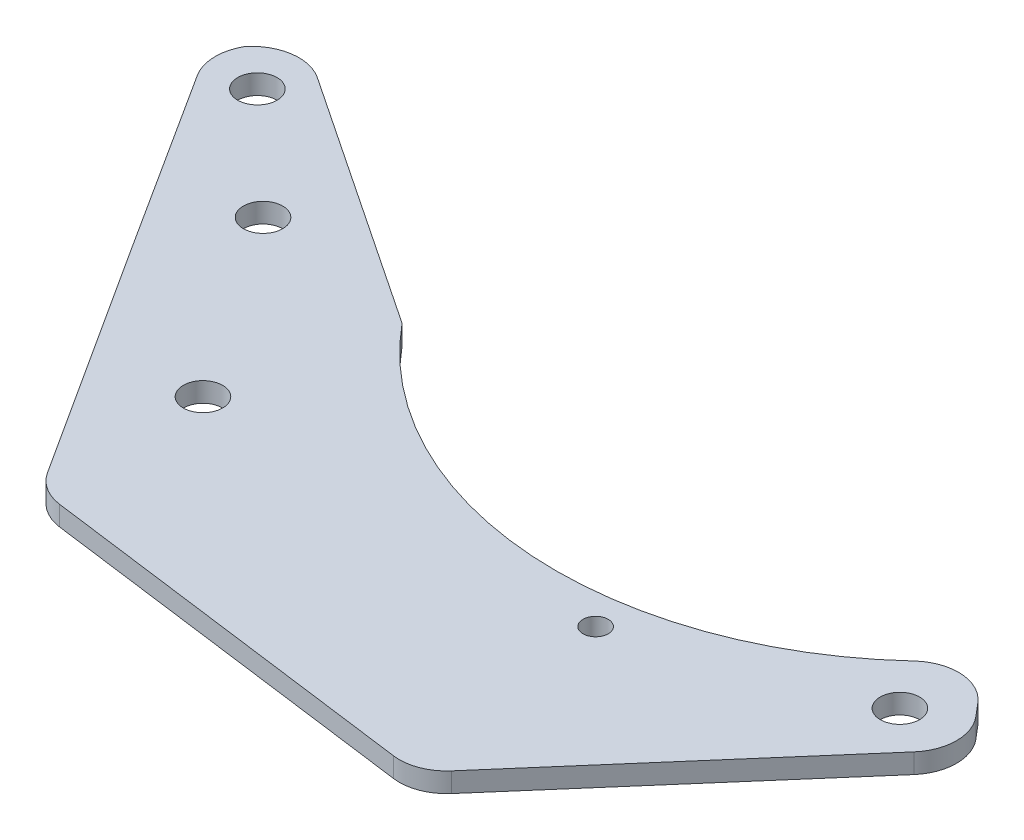
ISO-10303-21;
HEADER;
FILE_DESCRIPTION(('STEP AP214'),'2;1');
FILE_NAME('part.step','',(''),(''),'','','');
FILE_SCHEMA(('AUTOMOTIVE_DESIGN { 1 0 10303 214 1 1 1 1 }'));
ENDSEC;
DATA;
#1=APPLICATION_CONTEXT('core data for automotive mechanical design processes');
#2=APPLICATION_PROTOCOL_DEFINITION('international standard','automotive_design',2000,#1);
#3=PRODUCT_CONTEXT('',#1,'mechanical');
#4=PRODUCT('Part','Part','',(#3));
#5=PRODUCT_RELATED_PRODUCT_CATEGORY('part','',(#4));
#6=PRODUCT_DEFINITION_FORMATION('','',#4);
#7=PRODUCT_DEFINITION_CONTEXT('part definition',#1,'design');
#8=PRODUCT_DEFINITION('design','',#6,#7);
#9=PRODUCT_DEFINITION_SHAPE('','',#8);
#10=(LENGTH_UNIT() NAMED_UNIT(*) SI_UNIT(.MILLI.,.METRE.));
#11=(NAMED_UNIT(*) PLANE_ANGLE_UNIT() SI_UNIT($,.RADIAN.));
#12=(NAMED_UNIT(*) SI_UNIT($,.STERADIAN.) SOLID_ANGLE_UNIT());
#13=UNCERTAINTY_MEASURE_WITH_UNIT(LENGTH_MEASURE(1.E-05),#10,'distance_accuracy_value','');
#14=(GEOMETRIC_REPRESENTATION_CONTEXT(3) GLOBAL_UNCERTAINTY_ASSIGNED_CONTEXT((#13)) GLOBAL_UNIT_ASSIGNED_CONTEXT((#10,
#11,#12)) REPRESENTATION_CONTEXT('',''));
#15=CARTESIAN_POINT('',(0.,0.,0.));
#16=DIRECTION('',(0.,0.,1.));
#17=DIRECTION('',(1.,0.,0.));
#18=AXIS2_PLACEMENT_3D('',#15,#16,#17);
#19=CARTESIAN_POINT('',(47.1273199646575,3.175,-24.0867955846987));
#20=DIRECTION('',(0.,1.,0.));
#21=DIRECTION('',(0.,0.,1.));
#22=AXIS2_PLACEMENT_3D('',#19,#20,#21);
#23=PLANE('',#22);
#24=CARTESIAN_POINT('',(58.0978853827932,3.175,41.4677419040865));
#25=DIRECTION('',(0.,1.,0.));
#26=DIRECTION('',(0.,0.,1.));
#27=AXIS2_PLACEMENT_3D('',#24,#25,#26);
#28=CIRCLE('',#27,2.03200000000004);
#29=CARTESIAN_POINT('',(58.0978853827932,3.175,43.4997419040865));
#30=VERTEX_POINT('',#29);
#31=EDGE_CURVE('E615',#30,#30,#28,.T.);
#32=ORIENTED_EDGE('',*,*,#31,.F.);
#33=EDGE_LOOP('',(#32));
#34=FACE_BOUND('',#33,.T.);
#35=DIRECTION('',(-0.539216151652873,0.,-0.842167407227723));
#36=VECTOR('',#35,1.);
#37=CARTESIAN_POINT('',(-31.7827895527022,3.175,26.688950722057));
#38=LINE('',#37,#36);
#39=CARTESIAN_POINT('',(-31.7884003682894,3.175,26.6801875461005));
#40=VERTEX_POINT('',#39);
#41=CARTESIAN_POINT('',(-51.0580496985271,3.175,-3.41585198255375));
#42=VERTEX_POINT('',#41);
#43=EDGE_CURVE('E283',#40,#42,#38,.T.);
#44=ORIENTED_EDGE('',*,*,#43,.F.);
#45=CARTESIAN_POINT('',(-25.3710847252141,3.175,22.5713604705057));
#46=DIRECTION('',(0.,1.,0.));
#47=DIRECTION('',(0.,0.,1.));
#48=AXIS2_PLACEMENT_3D('',#45,#46,#47);
#49=CIRCLE('',#48,7.62);
#50=CARTESIAN_POINT('',(-31.777154824944,3.175,26.6976985416465));
#51=VERTEX_POINT('',#50);
#52=EDGE_CURVE('E370',#40,#51,#49,.T.);
#53=ORIENTED_EDGE('',*,*,#52,.T.);
#54=DIRECTION('',(-0.541514182564423,0.,-0.840691614137779));
#55=VECTOR('',#54,1.);
#56=CARTESIAN_POINT('',(-5.70831283131373,3.175,67.1691350431651));
#57=LINE('',#56,#55);
#58=CARTESIAN_POINT('',(-7.61855962427159,3.175,64.2035091898067));
#59=VERTEX_POINT('',#58);
#60=EDGE_CURVE('E286',#59,#51,#57,.T.);
#61=ORIENTED_EDGE('',*,*,#60,.F.);
#62=CARTESIAN_POINT('',(-1.21248952454171,3.175,60.0771711186658));
#63=DIRECTION('',(0.,1.,0.));
#64=DIRECTION('',(0.,0.,1.));
#65=AXIS2_PLACEMENT_3D('',#62,#63,#64);
#66=CIRCLE('',#65,7.62);
#67=CARTESIAN_POINT('',(-2.21113598814985,3.175,67.6314483998306));
#68=VERTEX_POINT('',#67);
#69=EDGE_CURVE('E363',#59,#68,#66,.T.);
#70=ORIENTED_EDGE('',*,*,#69,.T.);
#71=DIRECTION('',(0.991374971281472,0.,0.131055966352775));
#72=VECTOR('',#71,1.);
#73=CARTESIAN_POINT('',(-5.70831283131373,3.175,67.1691350431651));
#74=LINE('',#73,#72);
#75=CARTESIAN_POINT('',(59.8722355419621,3.175,75.8386318430437));
#76=VERTEX_POINT('',#75);
#77=EDGE_CURVE('E279',#68,#76,#74,.T.);
#78=ORIENTED_EDGE('',*,*,#77,.T.);
#79=CARTESIAN_POINT('',(60.8708820055702,3.175,68.2843545618789));
#80=DIRECTION('',(0.,1.,0.));
#81=DIRECTION('',(0.,0.,1.));
#82=AXIS2_PLACEMENT_3D('',#79,#80,#81);
#83=CIRCLE('',#82,7.62);
#84=CARTESIAN_POINT('',(66.6278741334779,3.175,73.2764925446683));
#85=VERTEX_POINT('',#84);
#86=EDGE_CURVE('E361',#76,#85,#83,.T.);
#87=ORIENTED_EDGE('',*,*,#86,.T.);
#88=DIRECTION('',(0.655136218213834,0.,-0.755510777940643));
#89=VECTOR('',#88,1.);
#90=CARTESIAN_POINT('',(63.9398489644405,3.175,76.3763547261859));
#91=LINE('',#90,#89);
#92=CARTESIAN_POINT('',(101.305782162095,3.175,33.2855218981585));
#93=VERTEX_POINT('',#92);
#94=EDGE_CURVE('E292',#85,#93,#91,.T.);
#95=ORIENTED_EDGE('',*,*,#94,.T.);
#96=CARTESIAN_POINT('',(95.5487900341878,3.175,28.2933839153691));
#97=DIRECTION('',(0.,1.,0.));
#98=DIRECTION('',(0.,0.,1.));
#99=AXIS2_PLACEMENT_3D('',#96,#97,#98);
#100=CIRCLE('',#99,7.62);
#101=CARTESIAN_POINT('',(101.355440507532,3.175,23.3590946777577));
#102=VERTEX_POINT('',#101);
#103=EDGE_CURVE('E362',#93,#102,#100,.T.);
#104=ORIENTED_EDGE('',*,*,#103,.T.);
#105=DIRECTION('',(0.647544519371576,0.,0.762027621173822));
#106=VECTOR('',#105,1.);
#107=CARTESIAN_POINT('',(94.0777766448611,3.175,14.794770967079));
#108=LINE('',#107,#106);
#109=CARTESIAN_POINT('',(99.5714705500373,3.175,21.259726460921));
#110=VERTEX_POINT('',#109);
#111=EDGE_CURVE('E289',#110,#102,#108,.T.);
#112=ORIENTED_EDGE('',*,*,#111,.F.);
#113=CARTESIAN_POINT('',(93.7648200766928,3.175,26.1940156985324));
#114=DIRECTION('',(0.,1.,0.));
#115=DIRECTION('',(0.,0.,1.));
#116=AXIS2_PLACEMENT_3D('',#113,#114,#115);
#117=CIRCLE('',#116,7.62);
#118=CARTESIAN_POINT('',(88.5828756198,3.175,20.6072588892845));
#119=VERTEX_POINT('',#118);
#120=EDGE_CURVE('E290',#110,#119,#117,.T.);
#121=ORIENTED_EDGE('',*,*,#120,.T.);
#122=CARTESIAN_POINT('',(47.1273199646575,3.175,-24.0867955846987));
#123=DIRECTION('',(0.,1.,0.));
#124=DIRECTION('',(0.,0.,1.));
#125=AXIS2_PLACEMENT_3D('',#122,#123,#124);
#126=CIRCLE('',#125,60.96);
#127=CARTESIAN_POINT('',(0.0977766448611159,3.175,14.6990736866145));
#128=VERTEX_POINT('',#127);
#129=EDGE_CURVE('E269',#128,#119,#126,.T.);
#130=ORIENTED_EDGE('',*,*,#129,.F.);
#131=DIRECTION('',(-0.831573270189138,0.,-0.555415066690617));
#132=VECTOR('',#131,1.);
#133=CARTESIAN_POINT('',(0.0977766448611159,3.175,14.6990736866145));
#134=LINE('',#133,#132);
#135=CARTESIAN_POINT('',(-41.1039819007353,3.175,-12.8199415231555));
#136=VERTEX_POINT('',#135);
#137=EDGE_CURVE('E280',#128,#136,#134,.T.);
#138=ORIENTED_EDGE('',*,*,#137,.T.);
#139=CARTESIAN_POINT('',(-45.3362447089178,3.175,-6.48335320431431));
#140=DIRECTION('',(0.,1.,0.));
#141=DIRECTION('',(0.,0.,1.));
#142=AXIS2_PLACEMENT_3D('',#139,#140,#141);
#143=CIRCLE('',#142,7.62);
#144=CARTESIAN_POINT('',(-51.3036506342044,3.175,-11.2219676139128));
#145=VERTEX_POINT('',#144);
#146=EDGE_CURVE('E178',#136,#145,#143,.T.);
#147=ORIENTED_EDGE('',*,*,#146,.T.);
#148=CARTESIAN_POINT('',(-44.6407340554518,3.175,-7.52467905814864));
#149=DIRECTION('',(0.,1.,0.));
#150=DIRECTION('',(0.,0.,1.));
#151=AXIS2_PLACEMENT_3D('',#148,#149,#150);
#152=CIRCLE('',#151,7.62);
#153=EDGE_CURVE('E357',#145,#42,#152,.T.);
#154=ORIENTED_EDGE('',*,*,#153,.T.);
#155=EDGE_LOOP('',(#44,#53,#61,#70,#78,#87,#95,#104,#112,#121,#130,#138,#147,#154));
#156=FACE_BOUND('',#155,.T.);
#157=CARTESIAN_POINT('',(-5.70831283131373,3.175,41.0206094265709));
#158=DIRECTION('',(0.,1.,0.));
#159=DIRECTION('',(0.,0.,1.));
#160=AXIS2_PLACEMENT_3D('',#157,#158,#159);
#161=CIRCLE('',#160,3.17500000000001);
#162=CARTESIAN_POINT('',(-5.70831283131373,3.175,44.1956094265709));
#163=VERTEX_POINT('',#162);
#164=EDGE_CURVE('E306',#163,#163,#161,.T.);
#165=ORIENTED_EDGE('',*,*,#164,.F.);
#166=EDGE_LOOP('',(#165));
#167=FACE_BOUND('',#166,.T.);
#168=CARTESIAN_POINT('',(94.0777766448611,3.175,28.3436220715496));
#169=DIRECTION('',(0.,1.,0.));
#170=DIRECTION('',(0.,0.,1.));
#171=AXIS2_PLACEMENT_3D('',#168,#169,#170);
#172=CIRCLE('',#171,3.17500000000003);
#173=CARTESIAN_POINT('',(94.0777766448611,3.175,31.5186220715496));
#174=VERTEX_POINT('',#173);
#175=EDGE_CURVE('E616',#174,#174,#172,.T.);
#176=ORIENTED_EDGE('',*,*,#175,.F.);
#177=EDGE_LOOP('',(#176));
#178=FACE_BOUND('',#177,.T.);
#179=CARTESIAN_POINT('',(-25.9198446169182,3.175,11.1165866957824));
#180=DIRECTION('',(0.,1.,0.));
#181=DIRECTION('',(0.,0.,1.));
#182=AXIS2_PLACEMENT_3D('',#179,#180,#181);
#183=CIRCLE('',#182,3.175);
#184=CARTESIAN_POINT('',(-25.9198446169182,3.175,14.2915866957824));
#185=VERTEX_POINT('',#184);
#186=EDGE_CURVE('E325',#185,#185,#183,.T.);
#187=ORIENTED_EDGE('',*,*,#186,.F.);
#188=EDGE_LOOP('',(#187));
#189=FACE_BOUND('',#188,.T.);
#190=CARTESIAN_POINT('',(-44.3312223587399,3.175,-6.38144661221973));
#191=DIRECTION('',(0.,1.,0.));
#192=DIRECTION('',(0.,0.,1.));
#193=AXIS2_PLACEMENT_3D('',#190,#191,#192);
#194=CIRCLE('',#193,3.175);
#195=CARTESIAN_POINT('',(-44.3312223587399,3.175,-3.20644661221973));
#196=VERTEX_POINT('',#195);
#197=EDGE_CURVE('E317',#196,#196,#194,.T.);
#198=ORIENTED_EDGE('',*,*,#197,.F.);
#199=EDGE_LOOP('',(#198));
#200=FACE_BOUND('',#199,.T.);
#201=ADVANCED_FACE('F162',(#34,#156,#167,#178,#189,#200),#23,.T.);
#202=CARTESIAN_POINT('',(47.1273199646575,0.,-24.0867955846987));
#203=DIRECTION('',(0.,1.,0.));
#204=DIRECTION('',(0.,0.,1.));
#205=AXIS2_PLACEMENT_3D('',#202,#203,#204);
#206=PLANE('',#205);
#207=DIRECTION('',(-0.541514182564423,0.,-0.840691614137779));
#208=VECTOR('',#207,1.);
#209=CARTESIAN_POINT('',(-5.70831283131373,0.,67.1691350431651));
#210=LINE('',#209,#208);
#211=CARTESIAN_POINT('',(-7.61855962427159,0.,64.2035091898067));
#212=VERTEX_POINT('',#211);
#213=CARTESIAN_POINT('',(-31.777154824944,0.,26.6976985416465));
#214=VERTEX_POINT('',#213);
#215=EDGE_CURVE('E303',#212,#214,#210,.T.);
#216=ORIENTED_EDGE('',*,*,#215,.T.);
#217=CARTESIAN_POINT('',(-25.3710847252141,0.,22.5713604705057));
#218=DIRECTION('',(0.,1.,0.));
#219=DIRECTION('',(0.,0.,1.));
#220=AXIS2_PLACEMENT_3D('',#217,#218,#219);
#221=CIRCLE('',#220,7.62);
#222=CARTESIAN_POINT('',(-31.7884003682894,0.,26.6801875461005));
#223=VERTEX_POINT('',#222);
#224=EDGE_CURVE('E352',#214,#223,#221,.F.);
#225=ORIENTED_EDGE('',*,*,#224,.T.);
#226=DIRECTION('',(-0.539216151652873,0.,-0.842167407227723));
#227=VECTOR('',#226,1.);
#228=CARTESIAN_POINT('',(-31.7827895527022,0.,26.688950722057));
#229=LINE('',#228,#227);
#230=CARTESIAN_POINT('',(-51.0580496985271,0.,-3.41585198255375));
#231=VERTEX_POINT('',#230);
#232=EDGE_CURVE('E328',#223,#231,#229,.T.);
#233=ORIENTED_EDGE('',*,*,#232,.T.);
#234=CARTESIAN_POINT('',(-44.6407340554518,0.,-7.52467905814864));
#235=DIRECTION('',(0.,1.,0.));
#236=DIRECTION('',(0.,0.,1.));
#237=AXIS2_PLACEMENT_3D('',#234,#235,#236);
#238=CIRCLE('',#237,7.62);
#239=CARTESIAN_POINT('',(-51.3036506342044,0.,-11.2219676139128));
#240=VERTEX_POINT('',#239);
#241=EDGE_CURVE('E339',#231,#240,#238,.F.);
#242=ORIENTED_EDGE('',*,*,#241,.T.);
#243=CARTESIAN_POINT('',(-45.3362447089178,0.,-6.48335320431431));
#244=DIRECTION('',(0.,1.,0.));
#245=DIRECTION('',(0.,0.,1.));
#246=AXIS2_PLACEMENT_3D('',#243,#244,#245);
#247=CIRCLE('',#246,7.62);
#248=CARTESIAN_POINT('',(-41.1039819007353,0.,-12.8199415231555));
#249=VERTEX_POINT('',#248);
#250=EDGE_CURVE('E344',#240,#249,#247,.F.);
#251=ORIENTED_EDGE('',*,*,#250,.T.);
#252=DIRECTION('',(-0.831573270189138,0.,-0.555415066690617));
#253=VECTOR('',#252,1.);
#254=CARTESIAN_POINT('',(0.0977766448611159,0.,14.6990736866145));
#255=LINE('',#254,#253);
#256=CARTESIAN_POINT('',(0.0977766448611159,0.,14.6990736866145));
#257=VERTEX_POINT('',#256);
#258=EDGE_CURVE('E327',#257,#249,#255,.T.);
#259=ORIENTED_EDGE('',*,*,#258,.F.);
#260=CARTESIAN_POINT('',(47.1273199646575,0.,-24.0867955846987));
#261=DIRECTION('',(0.,1.,0.));
#262=DIRECTION('',(0.,0.,1.));
#263=AXIS2_PLACEMENT_3D('',#260,#261,#262);
#264=CIRCLE('',#263,60.96);
#265=CARTESIAN_POINT('',(88.5828756198,0.,20.6072588892845));
#266=VERTEX_POINT('',#265);
#267=EDGE_CURVE('E272',#257,#266,#264,.T.);
#268=ORIENTED_EDGE('',*,*,#267,.T.);
#269=CARTESIAN_POINT('',(93.7648200766928,0.,26.1940156985324));
#270=DIRECTION('',(0.,1.,0.));
#271=DIRECTION('',(0.,0.,1.));
#272=AXIS2_PLACEMENT_3D('',#269,#270,#271);
#273=CIRCLE('',#272,7.62);
#274=CARTESIAN_POINT('',(99.5714705500373,0.,21.259726460921));
#275=VERTEX_POINT('',#274);
#276=EDGE_CURVE('E345',#266,#275,#273,.F.);
#277=ORIENTED_EDGE('',*,*,#276,.T.);
#278=DIRECTION('',(0.647544519371576,0.,0.762027621173822));
#279=VECTOR('',#278,1.);
#280=CARTESIAN_POINT('',(94.0777766448611,0.,14.794770967079));
#281=LINE('',#280,#279);
#282=CARTESIAN_POINT('',(101.355440507532,0.,23.3590946777577));
#283=VERTEX_POINT('',#282);
#284=EDGE_CURVE('E308',#275,#283,#281,.T.);
#285=ORIENTED_EDGE('',*,*,#284,.T.);
#286=CARTESIAN_POINT('',(95.5487900341878,0.,28.2933839153691));
#287=DIRECTION('',(0.,1.,0.));
#288=DIRECTION('',(0.,0.,1.));
#289=AXIS2_PLACEMENT_3D('',#286,#287,#288);
#290=CIRCLE('',#289,7.62);
#291=CARTESIAN_POINT('',(101.305782162095,0.,33.2855218981585));
#292=VERTEX_POINT('',#291);
#293=EDGE_CURVE('E349',#283,#292,#290,.F.);
#294=ORIENTED_EDGE('',*,*,#293,.T.);
#295=DIRECTION('',(0.655136218213834,0.,-0.755510777940643));
#296=VECTOR('',#295,1.);
#297=CARTESIAN_POINT('',(63.9398489644405,0.,76.3763547261859));
#298=LINE('',#297,#296);
#299=CARTESIAN_POINT('',(66.6278741334779,0.,73.2764925446683));
#300=VERTEX_POINT('',#299);
#301=EDGE_CURVE('E311',#300,#292,#298,.T.);
#302=ORIENTED_EDGE('',*,*,#301,.F.);
#303=CARTESIAN_POINT('',(60.8708820055702,0.,68.2843545618789));
#304=DIRECTION('',(0.,1.,0.));
#305=DIRECTION('',(0.,0.,1.));
#306=AXIS2_PLACEMENT_3D('',#303,#304,#305);
#307=CIRCLE('',#306,7.62);
#308=CARTESIAN_POINT('',(59.8722355419621,0.,75.8386318430437));
#309=VERTEX_POINT('',#308);
#310=EDGE_CURVE('E350',#300,#309,#307,.F.);
#311=ORIENTED_EDGE('',*,*,#310,.T.);
#312=DIRECTION('',(0.991374971281472,0.,0.131055966352775));
#313=VECTOR('',#312,1.);
#314=CARTESIAN_POINT('',(-5.70831283131373,0.,67.1691350431651));
#315=LINE('',#314,#313);
#316=CARTESIAN_POINT('',(-2.21113598814985,0.,67.6314483998306));
#317=VERTEX_POINT('',#316);
#318=EDGE_CURVE('E294',#317,#309,#315,.T.);
#319=ORIENTED_EDGE('',*,*,#318,.F.);
#320=CARTESIAN_POINT('',(-1.21248952454171,0.,60.0771711186658));
#321=DIRECTION('',(0.,1.,0.));
#322=DIRECTION('',(0.,0.,1.));
#323=AXIS2_PLACEMENT_3D('',#320,#321,#322);
#324=CIRCLE('',#323,7.62);
#325=EDGE_CURVE('E342',#317,#212,#324,.F.);
#326=ORIENTED_EDGE('',*,*,#325,.T.);
#327=EDGE_LOOP('',(#216,#225,#233,#242,#251,#259,#268,#277,#285,#294,#302,#311,#319,#326));
#328=FACE_BOUND('',#327,.T.);
#329=CARTESIAN_POINT('',(-5.70831283131373,0.,41.0206094265709));
#330=DIRECTION('',(0.,1.,0.));
#331=DIRECTION('',(0.,0.,1.));
#332=AXIS2_PLACEMENT_3D('',#329,#330,#331);
#333=CIRCLE('',#332,3.17500000000001);
#334=CARTESIAN_POINT('',(-5.70831283131373,0.,44.1956094265709));
#335=VERTEX_POINT('',#334);
#336=EDGE_CURVE('E614',#335,#335,#333,.T.);
#337=ORIENTED_EDGE('',*,*,#336,.T.);
#338=EDGE_LOOP('',(#337));
#339=FACE_BOUND('',#338,.T.);
#340=CARTESIAN_POINT('',(58.0978853827932,0.,41.4677419040865));
#341=DIRECTION('',(0.,1.,0.));
#342=DIRECTION('',(0.,0.,1.));
#343=AXIS2_PLACEMENT_3D('',#340,#341,#342);
#344=CIRCLE('',#343,2.03200000000004);
#345=CARTESIAN_POINT('',(58.0978853827932,0.,43.4997419040865));
#346=VERTEX_POINT('',#345);
#347=EDGE_CURVE('E611',#346,#346,#344,.T.);
#348=ORIENTED_EDGE('',*,*,#347,.T.);
#349=EDGE_LOOP('',(#348));
#350=FACE_BOUND('',#349,.T.);
#351=CARTESIAN_POINT('',(94.0777766448611,0.,28.3436220715496));
#352=DIRECTION('',(0.,1.,0.));
#353=DIRECTION('',(0.,0.,1.));
#354=AXIS2_PLACEMENT_3D('',#351,#352,#353);
#355=CIRCLE('',#354,3.17500000000003);
#356=CARTESIAN_POINT('',(94.0777766448611,0.,31.5186220715496));
#357=VERTEX_POINT('',#356);
#358=EDGE_CURVE('E277',#357,#357,#355,.T.);
#359=ORIENTED_EDGE('',*,*,#358,.T.);
#360=EDGE_LOOP('',(#359));
#361=FACE_BOUND('',#360,.T.);
#362=CARTESIAN_POINT('',(-25.9198446169182,0.,11.1165866957824));
#363=DIRECTION('',(0.,1.,0.));
#364=DIRECTION('',(0.,0.,1.));
#365=AXIS2_PLACEMENT_3D('',#362,#363,#364);
#366=CIRCLE('',#365,3.175);
#367=CARTESIAN_POINT('',(-25.9198446169182,0.,14.2915866957824));
#368=VERTEX_POINT('',#367);
#369=EDGE_CURVE('E316',#368,#368,#366,.T.);
#370=ORIENTED_EDGE('',*,*,#369,.T.);
#371=EDGE_LOOP('',(#370));
#372=FACE_BOUND('',#371,.T.);
#373=CARTESIAN_POINT('',(-44.3312223587399,0.,-6.38144661221973));
#374=DIRECTION('',(0.,1.,0.));
#375=DIRECTION('',(0.,0.,1.));
#376=AXIS2_PLACEMENT_3D('',#373,#374,#375);
#377=CIRCLE('',#376,3.175);
#378=CARTESIAN_POINT('',(-44.3312223587399,0.,-3.20644661221973));
#379=VERTEX_POINT('',#378);
#380=EDGE_CURVE('E318',#379,#379,#377,.T.);
#381=ORIENTED_EDGE('',*,*,#380,.T.);
#382=EDGE_LOOP('',(#381));
#383=FACE_BOUND('',#382,.T.);
#384=ADVANCED_FACE('F389',(#328,#339,#350,#361,#372,#383),#206,.F.);
#385=CARTESIAN_POINT('',(-5.70831283131373,3.175,67.1691350431651));
#386=DIRECTION('',(-0.840691614137779,0.,0.541514182564423));
#387=DIRECTION('',(0.541514182564423,0.,0.840691614137779));
#388=AXIS2_PLACEMENT_3D('',#385,#386,#387);
#389=PLANE('',#388);
#390=ORIENTED_EDGE('',*,*,#60,.T.);
#391=DIRECTION('',(0.,-1.,0.));
#392=VECTOR('',#391,1.);
#393=CARTESIAN_POINT('',(-31.777154824944,3.175,26.6976985416466));
#394=LINE('',#393,#392);
#395=EDGE_CURVE('E337',#51,#214,#394,.T.);
#396=ORIENTED_EDGE('',*,*,#395,.T.);
#397=ORIENTED_EDGE('',*,*,#215,.F.);
#398=DIRECTION('',(0.,-1.,0.));
#399=VECTOR('',#398,1.);
#400=CARTESIAN_POINT('',(-7.61855962427159,3.175,64.2035091898067));
#401=LINE('',#400,#399);
#402=EDGE_CURVE('E273',#212,#59,#401,.F.);
#403=ORIENTED_EDGE('',*,*,#402,.T.);
#404=EDGE_LOOP('',(#390,#396,#397,#403));
#405=FACE_BOUND('',#404,.T.);
#406=ADVANCED_FACE('F409',(#405),#389,.T.);
#407=CARTESIAN_POINT('',(-5.70831283131373,3.175,67.1691350431651));
#408=DIRECTION('',(0.131055966352775,0.,-0.991374971281472));
#409=DIRECTION('',(-0.991374971281473,0.,-0.131055966352775));
#410=AXIS2_PLACEMENT_3D('',#407,#408,#409);
#411=PLANE('',#410);
#412=ORIENTED_EDGE('',*,*,#318,.T.);
#413=DIRECTION('',(0.,-1.,0.));
#414=VECTOR('',#413,1.);
#415=CARTESIAN_POINT('',(59.8722355419621,3.175,75.8386318430437));
#416=LINE('',#415,#414);
#417=EDGE_CURVE('E385',#309,#76,#416,.F.);
#418=ORIENTED_EDGE('',*,*,#417,.T.);
#419=ORIENTED_EDGE('',*,*,#77,.F.);
#420=DIRECTION('',(0.,-1.,0.));
#421=VECTOR('',#420,1.);
#422=CARTESIAN_POINT('',(-2.21113598814985,0.,67.6314483998306));
#423=LINE('',#422,#421);
#424=EDGE_CURVE('E378',#68,#317,#423,.T.);
#425=ORIENTED_EDGE('',*,*,#424,.T.);
#426=EDGE_LOOP('',(#412,#418,#419,#425));
#427=FACE_BOUND('',#426,.T.);
#428=ADVANCED_FACE('F412',(#427),#411,.F.);
#429=CARTESIAN_POINT('',(63.9398489644405,3.175,76.3763547261859));
#430=DIRECTION('',(-0.755510777940643,0.,-0.655136218213834));
#431=DIRECTION('',(-0.655136218213834,0.,0.755510777940643));
#432=AXIS2_PLACEMENT_3D('',#429,#430,#431);
#433=PLANE('',#432);
#434=ORIENTED_EDGE('',*,*,#301,.T.);
#435=DIRECTION('',(0.,-1.,0.));
#436=VECTOR('',#435,1.);
#437=CARTESIAN_POINT('',(101.305782162095,3.175,33.2855218981585));
#438=LINE('',#437,#436);
#439=EDGE_CURVE('E380',#292,#93,#438,.F.);
#440=ORIENTED_EDGE('',*,*,#439,.T.);
#441=ORIENTED_EDGE('',*,*,#94,.F.);
#442=DIRECTION('',(0.,-1.,0.));
#443=VECTOR('',#442,1.);
#444=CARTESIAN_POINT('',(66.6278741334779,3.175,73.2764925446683));
#445=LINE('',#444,#443);
#446=EDGE_CURVE('E372',#85,#300,#445,.T.);
#447=ORIENTED_EDGE('',*,*,#446,.T.);
#448=EDGE_LOOP('',(#434,#440,#441,#447));
#449=FACE_BOUND('',#448,.T.);
#450=ADVANCED_FACE('F425',(#449),#433,.F.);
#451=CARTESIAN_POINT('',(94.0777766448611,3.175,14.794770967079));
#452=DIRECTION('',(0.762027621173822,0.,-0.647544519371576));
#453=DIRECTION('',(-0.647544519371576,0.,-0.762027621173822));
#454=AXIS2_PLACEMENT_3D('',#451,#452,#453);
#455=PLANE('',#454);
#456=ORIENTED_EDGE('',*,*,#111,.T.);
#457=DIRECTION('',(0.,-1.,0.));
#458=VECTOR('',#457,1.);
#459=CARTESIAN_POINT('',(101.355440507532,0.,23.3590946777577));
#460=LINE('',#459,#458);
#461=EDGE_CURVE('E371',#102,#283,#460,.T.);
#462=ORIENTED_EDGE('',*,*,#461,.T.);
#463=ORIENTED_EDGE('',*,*,#284,.F.);
#464=DIRECTION('',(0.,-1.,0.));
#465=VECTOR('',#464,1.);
#466=CARTESIAN_POINT('',(99.5714705500373,3.175,21.259726460921));
#467=LINE('',#466,#465);
#468=EDGE_CURVE('E367',#275,#110,#467,.F.);
#469=ORIENTED_EDGE('',*,*,#468,.T.);
#470=EDGE_LOOP('',(#456,#462,#463,#469));
#471=FACE_BOUND('',#470,.T.);
#472=ADVANCED_FACE('F431',(#471),#455,.T.);
#473=CARTESIAN_POINT('',(47.1273199646575,3.175,-24.0867955846987));
#474=DIRECTION('',(0.,-1.,0.));
#475=DIRECTION('',(0.,0.,-1.));
#476=AXIS2_PLACEMENT_3D('',#473,#474,#475);
#477=CYLINDRICAL_SURFACE('',#476,60.96);
#478=ORIENTED_EDGE('',*,*,#129,.T.);
#479=DIRECTION('',(0.,-1.,0.));
#480=VECTOR('',#479,1.);
#481=CARTESIAN_POINT('',(88.5828756198,3.175,20.6072588892845));
#482=LINE('',#481,#480);
#483=EDGE_CURVE('E171',#119,#266,#482,.T.);
#484=ORIENTED_EDGE('',*,*,#483,.T.);
#485=ORIENTED_EDGE('',*,*,#267,.F.);
#486=DIRECTION('',(0.,-1.,0.));
#487=VECTOR('',#486,1.);
#488=CARTESIAN_POINT('',(0.0977766448611159,3.175,14.6990736866145));
#489=LINE('',#488,#487);
#490=EDGE_CURVE('E261',#128,#257,#489,.T.);
#491=ORIENTED_EDGE('',*,*,#490,.F.);
#492=EDGE_LOOP('',(#478,#484,#485,#491));
#493=FACE_BOUND('',#492,.T.);
#494=ADVANCED_FACE('F262',(#493),#477,.F.);
#495=CARTESIAN_POINT('',(-5.70831283131373,3.175,41.0206094265709));
#496=DIRECTION('',(0.,-1.,0.));
#497=DIRECTION('',(0.,0.,-1.));
#498=AXIS2_PLACEMENT_3D('',#495,#496,#497);
#499=CYLINDRICAL_SURFACE('',#498,3.17500000000001);
#500=ORIENTED_EDGE('',*,*,#164,.T.);
#501=EDGE_LOOP('',(#500));
#502=FACE_BOUND('',#501,.T.);
#503=ORIENTED_EDGE('',*,*,#336,.F.);
#504=EDGE_LOOP('',(#503));
#505=FACE_BOUND('',#504,.T.);
#506=ADVANCED_FACE('F533',(#502,#505),#499,.F.);
#507=CARTESIAN_POINT('',(58.0978853827932,3.175,41.4677419040865));
#508=DIRECTION('',(0.,-1.,0.));
#509=DIRECTION('',(0.,0.,-1.));
#510=AXIS2_PLACEMENT_3D('',#507,#508,#509);
#511=CYLINDRICAL_SURFACE('',#510,2.03200000000004);
#512=ORIENTED_EDGE('',*,*,#31,.T.);
#513=EDGE_LOOP('',(#512));
#514=FACE_BOUND('',#513,.T.);
#515=ORIENTED_EDGE('',*,*,#347,.F.);
#516=EDGE_LOOP('',(#515));
#517=FACE_BOUND('',#516,.T.);
#518=ADVANCED_FACE('F527',(#514,#517),#511,.F.);
#519=CARTESIAN_POINT('',(94.0777766448611,3.175,28.3436220715496));
#520=DIRECTION('',(0.,-1.,0.));
#521=DIRECTION('',(0.,0.,-1.));
#522=AXIS2_PLACEMENT_3D('',#519,#520,#521);
#523=CYLINDRICAL_SURFACE('',#522,3.17500000000003);
#524=ORIENTED_EDGE('',*,*,#175,.T.);
#525=EDGE_LOOP('',(#524));
#526=FACE_BOUND('',#525,.T.);
#527=ORIENTED_EDGE('',*,*,#358,.F.);
#528=EDGE_LOOP('',(#527));
#529=FACE_BOUND('',#528,.T.);
#530=ADVANCED_FACE('F449',(#526,#529),#523,.F.);
#531=CARTESIAN_POINT('',(-44.3312223587399,3.175,-6.38144661221973));
#532=DIRECTION('',(0.,-1.,0.));
#533=DIRECTION('',(0.,0.,-1.));
#534=AXIS2_PLACEMENT_3D('',#531,#532,#533);
#535=CYLINDRICAL_SURFACE('',#534,3.175);
#536=ORIENTED_EDGE('',*,*,#197,.T.);
#537=EDGE_LOOP('',(#536));
#538=FACE_BOUND('',#537,.T.);
#539=ORIENTED_EDGE('',*,*,#380,.F.);
#540=EDGE_LOOP('',(#539));
#541=FACE_BOUND('',#540,.T.);
#542=ADVANCED_FACE('F509',(#538,#541),#535,.F.);
#543=CARTESIAN_POINT('',(-25.9198446169182,3.175,11.1165866957824));
#544=DIRECTION('',(0.,-1.,0.));
#545=DIRECTION('',(0.,0.,-1.));
#546=AXIS2_PLACEMENT_3D('',#543,#544,#545);
#547=CYLINDRICAL_SURFACE('',#546,3.175);
#548=ORIENTED_EDGE('',*,*,#186,.T.);
#549=EDGE_LOOP('',(#548));
#550=FACE_BOUND('',#549,.T.);
#551=ORIENTED_EDGE('',*,*,#369,.F.);
#552=EDGE_LOOP('',(#551));
#553=FACE_BOUND('',#552,.T.);
#554=ADVANCED_FACE('F446',(#550,#553),#547,.F.);
#555=CARTESIAN_POINT('',(0.0977766448611159,3.175,14.6990736866145));
#556=DIRECTION('',(-0.555415066690617,0.,0.831573270189138));
#557=DIRECTION('',(0.831573270189138,0.,0.555415066690617));
#558=AXIS2_PLACEMENT_3D('',#555,#556,#557);
#559=PLANE('',#558);
#560=ORIENTED_EDGE('',*,*,#258,.T.);
#561=DIRECTION('',(0.,-1.,0.));
#562=VECTOR('',#561,1.);
#563=CARTESIAN_POINT('',(-41.1039819007353,3.175,-12.8199415231556));
#564=LINE('',#563,#562);
#565=EDGE_CURVE('E12',#249,#136,#564,.F.);
#566=ORIENTED_EDGE('',*,*,#565,.T.);
#567=ORIENTED_EDGE('',*,*,#137,.F.);
#568=ORIENTED_EDGE('',*,*,#490,.T.);
#569=EDGE_LOOP('',(#560,#566,#567,#568));
#570=FACE_BOUND('',#569,.T.);
#571=ADVANCED_FACE('F278',(#570),#559,.F.);
#572=CARTESIAN_POINT('',(-31.7827895527022,3.175,26.688950722057));
#573=DIRECTION('',(-0.842167407227723,0.,0.539216151652873));
#574=DIRECTION('',(0.539216151652873,0.,0.842167407227723));
#575=AXIS2_PLACEMENT_3D('',#572,#573,#574);
#576=PLANE('',#575);
#577=ORIENTED_EDGE('',*,*,#232,.F.);
#578=DIRECTION('',(0.,-1.,0.));
#579=VECTOR('',#578,1.);
#580=CARTESIAN_POINT('',(-31.7884003682894,3.175,26.6801875461005));
#581=LINE('',#580,#579);
#582=EDGE_CURVE('E353',#223,#40,#581,.F.);
#583=ORIENTED_EDGE('',*,*,#582,.T.);
#584=ORIENTED_EDGE('',*,*,#43,.T.);
#585=DIRECTION('',(0.,-1.,0.));
#586=VECTOR('',#585,1.);
#587=CARTESIAN_POINT('',(-51.0580496985271,0.,-3.41585198255375));
#588=LINE('',#587,#586);
#589=EDGE_CURVE('E354',#42,#231,#588,.T.);
#590=ORIENTED_EDGE('',*,*,#589,.T.);
#591=EDGE_LOOP('',(#577,#583,#584,#590));
#592=FACE_BOUND('',#591,.T.);
#593=ADVANCED_FACE('F399',(#592),#576,.T.);
#594=CARTESIAN_POINT('',(-25.3710847252141,3.175,22.5713604705057));
#595=DIRECTION('',(0.,-1.,0.));
#596=DIRECTION('',(0.,0.,-1.));
#597=AXIS2_PLACEMENT_3D('',#594,#595,#596);
#598=CYLINDRICAL_SURFACE('',#597,7.62);
#599=ORIENTED_EDGE('',*,*,#52,.F.);
#600=ORIENTED_EDGE('',*,*,#582,.F.);
#601=ORIENTED_EDGE('',*,*,#224,.F.);
#602=ORIENTED_EDGE('',*,*,#395,.F.);
#603=EDGE_LOOP('',(#599,#600,#601,#602));
#604=FACE_BOUND('',#603,.T.);
#605=ADVANCED_FACE('F402',(#604),#598,.T.);
#606=CARTESIAN_POINT('',(95.5487900341878,3.175,28.2933839153691));
#607=DIRECTION('',(0.,1.,0.));
#608=DIRECTION('',(0.,0.,1.));
#609=AXIS2_PLACEMENT_3D('',#606,#607,#608);
#610=CYLINDRICAL_SURFACE('',#609,7.62);
#611=ORIENTED_EDGE('',*,*,#103,.F.);
#612=ORIENTED_EDGE('',*,*,#439,.F.);
#613=ORIENTED_EDGE('',*,*,#293,.F.);
#614=ORIENTED_EDGE('',*,*,#461,.F.);
#615=EDGE_LOOP('',(#611,#612,#613,#614));
#616=FACE_BOUND('',#615,.T.);
#617=ADVANCED_FACE('F426',(#616),#610,.T.);
#618=CARTESIAN_POINT('',(60.8708820055702,3.175,68.2843545618789));
#619=DIRECTION('',(0.,-1.,0.));
#620=DIRECTION('',(0.,0.,-1.));
#621=AXIS2_PLACEMENT_3D('',#618,#619,#620);
#622=CYLINDRICAL_SURFACE('',#621,7.62);
#623=ORIENTED_EDGE('',*,*,#86,.F.);
#624=ORIENTED_EDGE('',*,*,#417,.F.);
#625=ORIENTED_EDGE('',*,*,#310,.F.);
#626=ORIENTED_EDGE('',*,*,#446,.F.);
#627=EDGE_LOOP('',(#623,#624,#625,#626));
#628=FACE_BOUND('',#627,.T.);
#629=ADVANCED_FACE('F416',(#628),#622,.T.);
#630=CARTESIAN_POINT('',(-1.21248952454171,3.175,60.0771711186658));
#631=DIRECTION('',(0.,1.,0.));
#632=DIRECTION('',(0.,0.,1.));
#633=AXIS2_PLACEMENT_3D('',#630,#631,#632);
#634=CYLINDRICAL_SURFACE('',#633,7.62);
#635=ORIENTED_EDGE('',*,*,#69,.F.);
#636=ORIENTED_EDGE('',*,*,#402,.F.);
#637=ORIENTED_EDGE('',*,*,#325,.F.);
#638=ORIENTED_EDGE('',*,*,#424,.F.);
#639=EDGE_LOOP('',(#635,#636,#637,#638));
#640=FACE_BOUND('',#639,.T.);
#641=ADVANCED_FACE('F407',(#640),#634,.T.);
#642=CARTESIAN_POINT('',(93.7648200766928,3.175,26.1940156985324));
#643=DIRECTION('',(0.,-1.,0.));
#644=DIRECTION('',(0.,0.,-1.));
#645=AXIS2_PLACEMENT_3D('',#642,#643,#644);
#646=CYLINDRICAL_SURFACE('',#645,7.62);
#647=ORIENTED_EDGE('',*,*,#120,.F.);
#648=ORIENTED_EDGE('',*,*,#468,.F.);
#649=ORIENTED_EDGE('',*,*,#276,.F.);
#650=ORIENTED_EDGE('',*,*,#483,.F.);
#651=EDGE_LOOP('',(#647,#648,#649,#650));
#652=FACE_BOUND('',#651,.T.);
#653=ADVANCED_FACE('F433',(#652),#646,.T.);
#654=CARTESIAN_POINT('',(-44.6407340554518,3.175,-7.52467905814864));
#655=DIRECTION('',(0.,1.,0.));
#656=DIRECTION('',(0.,0.,1.));
#657=AXIS2_PLACEMENT_3D('',#654,#655,#656);
#658=CYLINDRICAL_SURFACE('',#657,7.62);
#659=ORIENTED_EDGE('',*,*,#589,.F.);
#660=ORIENTED_EDGE('',*,*,#153,.F.);
#661=DIRECTION('',(0.,1.,0.));
#662=VECTOR('',#661,1.);
#663=CARTESIAN_POINT('',(-51.3036506342044,1.5875,-11.2219676139128));
#664=LINE('',#663,#662);
#665=EDGE_CURVE('E168',#240,#145,#664,.T.);
#666=ORIENTED_EDGE('',*,*,#665,.F.);
#667=ORIENTED_EDGE('',*,*,#241,.F.);
#668=EDGE_LOOP('',(#659,#660,#666,#667));
#669=FACE_BOUND('',#668,.T.);
#670=ADVANCED_FACE('F165',(#669),#658,.T.);
#671=CARTESIAN_POINT('',(-45.3362447089178,3.175,-6.48335320431431));
#672=DIRECTION('',(0.,-1.,0.));
#673=DIRECTION('',(0.,0.,-1.));
#674=AXIS2_PLACEMENT_3D('',#671,#672,#673);
#675=CYLINDRICAL_SURFACE('',#674,7.62);
#676=ORIENTED_EDGE('',*,*,#146,.F.);
#677=ORIENTED_EDGE('',*,*,#565,.F.);
#678=ORIENTED_EDGE('',*,*,#250,.F.);
#679=ORIENTED_EDGE('',*,*,#665,.T.);
#680=EDGE_LOOP('',(#676,#677,#678,#679));
#681=FACE_BOUND('',#680,.T.);
#682=ADVANCED_FACE('F387',(#681),#675,.T.);
#683=CLOSED_SHELL('',(#201,#384,#406,#428,#450,#472,#494,#506,#518,#530,#542,#554,#571,#593,
#605,#617,#629,#641,#653,#670,#682));
#684=MANIFOLD_SOLID_BREP('B2',#683);
#685=ADVANCED_BREP_SHAPE_REPRESENTATION('',(#18,#684),#14);
#686=SHAPE_DEFINITION_REPRESENTATION(#9,#685);
ENDSEC;
END-ISO-10303-21;
